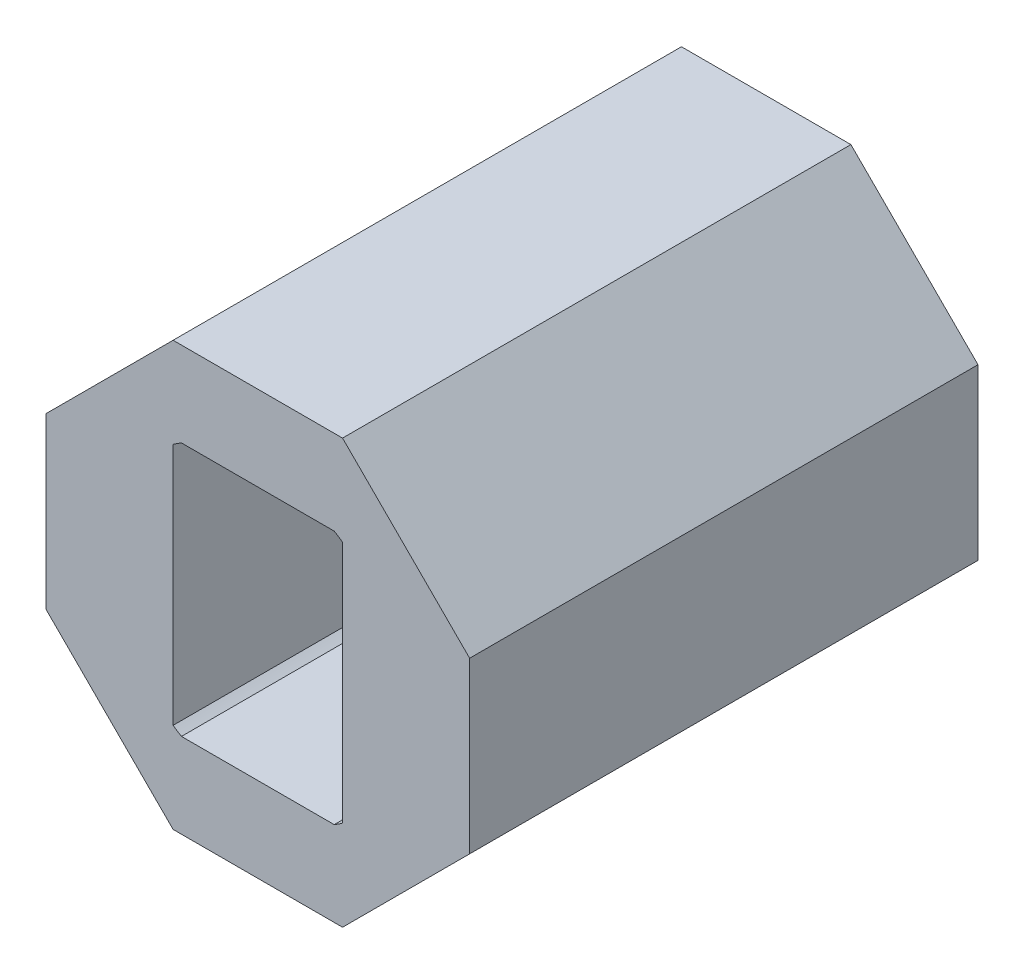
ISO-10303-21;
HEADER;
FILE_DESCRIPTION(('STEP AP214'),'2;1');
FILE_NAME('part.step','',(''),(''),'','','');
FILE_SCHEMA(('AUTOMOTIVE_DESIGN { 1 0 10303 214 1 1 1 1 }'));
ENDSEC;
DATA;
#1=APPLICATION_CONTEXT('core data for automotive mechanical design processes');
#2=APPLICATION_PROTOCOL_DEFINITION('international standard','automotive_design',2000,#1);
#3=PRODUCT_CONTEXT('',#1,'mechanical');
#4=PRODUCT('Part','Part','',(#3));
#5=PRODUCT_RELATED_PRODUCT_CATEGORY('part','',(#4));
#6=PRODUCT_DEFINITION_FORMATION('','',#4);
#7=PRODUCT_DEFINITION_CONTEXT('part definition',#1,'design');
#8=PRODUCT_DEFINITION('design','',#6,#7);
#9=PRODUCT_DEFINITION_SHAPE('','',#8);
#10=(LENGTH_UNIT() NAMED_UNIT(*) SI_UNIT(.MILLI.,.METRE.));
#11=(NAMED_UNIT(*) PLANE_ANGLE_UNIT() SI_UNIT($,.RADIAN.));
#12=(NAMED_UNIT(*) SI_UNIT($,.STERADIAN.) SOLID_ANGLE_UNIT());
#13=UNCERTAINTY_MEASURE_WITH_UNIT(LENGTH_MEASURE(1.E-05),#10,'distance_accuracy_value','');
#14=(GEOMETRIC_REPRESENTATION_CONTEXT(3) GLOBAL_UNCERTAINTY_ASSIGNED_CONTEXT((#13)) GLOBAL_UNIT_ASSIGNED_CONTEXT((#10,
#11,#12)) REPRESENTATION_CONTEXT('',''));
#15=CARTESIAN_POINT('',(0.,0.,0.));
#16=DIRECTION('',(0.,0.,1.));
#17=DIRECTION('',(1.,0.,0.));
#18=AXIS2_PLACEMENT_3D('',#15,#16,#17);
#19=CARTESIAN_POINT('',(0.,10.,12.));
#20=DIRECTION('',(0.,1.,0.));
#21=DIRECTION('',(-1.,0.,0.));
#22=AXIS2_PLACEMENT_3D('',#19,#20,#21);
#23=PLANE('',#22);
#24=DIRECTION('',(1.,0.,0.));
#25=VECTOR('',#24,1.);
#26=CARTESIAN_POINT('',(0.,10.,0.));
#27=LINE('',#26,#25);
#28=CARTESIAN_POINT('',(3.,10.,0.));
#29=VERTEX_POINT('',#28);
#30=CARTESIAN_POINT('',(7.,10.,0.));
#31=VERTEX_POINT('',#30);
#32=EDGE_CURVE('E262',#29,#31,#27,.T.);
#33=ORIENTED_EDGE('',*,*,#32,.F.);
#34=DIRECTION('',(0.,0.,-1.));
#35=VECTOR('',#34,1.);
#36=CARTESIAN_POINT('',(3.,10.,12.));
#37=LINE('',#36,#35);
#38=CARTESIAN_POINT('',(3.,10.,12.));
#39=VERTEX_POINT('',#38);
#40=EDGE_CURVE('E11',#39,#29,#37,.T.);
#41=ORIENTED_EDGE('',*,*,#40,.F.);
#42=DIRECTION('',(1.,0.,0.));
#43=VECTOR('',#42,1.);
#44=CARTESIAN_POINT('',(0.,10.,12.));
#45=LINE('',#44,#43);
#46=CARTESIAN_POINT('',(7.,10.,12.));
#47=VERTEX_POINT('',#46);
#48=EDGE_CURVE('E302',#39,#47,#45,.T.);
#49=ORIENTED_EDGE('',*,*,#48,.T.);
#50=DIRECTION('',(0.,0.,-1.));
#51=VECTOR('',#50,1.);
#52=CARTESIAN_POINT('',(7.,10.,12.));
#53=LINE('',#52,#51);
#54=EDGE_CURVE('E123',#47,#31,#53,.T.);
#55=ORIENTED_EDGE('',*,*,#54,.T.);
#56=EDGE_LOOP('',(#33,#41,#49,#55));
#57=FACE_BOUND('',#56,.T.);
#58=ADVANCED_FACE('F45',(#57),#23,.T.);
#59=CARTESIAN_POINT('',(-3.5,3.5,12.));
#60=DIRECTION('',(0.707106781186547,-0.707106781186547,0.));
#61=DIRECTION('',(0.707106781186548,0.707106781186548,0.));
#62=AXIS2_PLACEMENT_3D('',#59,#60,#61);
#63=PLANE('',#62);
#64=DIRECTION('',(-0.707106781186548,-0.707106781186548,0.));
#65=VECTOR('',#64,1.);
#66=CARTESIAN_POINT('',(-3.5,3.5,0.));
#67=LINE('',#66,#65);
#68=CARTESIAN_POINT('',(0.,7.,0.));
#69=VERTEX_POINT('',#68);
#70=EDGE_CURVE('E258',#29,#69,#67,.T.);
#71=ORIENTED_EDGE('',*,*,#70,.T.);
#72=DIRECTION('',(0.,0.,-1.));
#73=VECTOR('',#72,1.);
#74=CARTESIAN_POINT('',(0.,7.,12.));
#75=LINE('',#74,#73);
#76=CARTESIAN_POINT('',(0.,7.,12.));
#77=VERTEX_POINT('',#76);
#78=EDGE_CURVE('E56',#77,#69,#75,.T.);
#79=ORIENTED_EDGE('',*,*,#78,.F.);
#80=DIRECTION('',(-0.707106781186548,-0.707106781186548,0.));
#81=VECTOR('',#80,1.);
#82=CARTESIAN_POINT('',(-3.5,3.5,12.));
#83=LINE('',#82,#81);
#84=EDGE_CURVE('E299',#39,#77,#83,.T.);
#85=ORIENTED_EDGE('',*,*,#84,.F.);
#86=ORIENTED_EDGE('',*,*,#40,.T.);
#87=EDGE_LOOP('',(#71,#79,#85,#86));
#88=FACE_BOUND('',#87,.T.);
#89=ADVANCED_FACE('F368',(#88),#63,.F.);
#90=CARTESIAN_POINT('',(0.,0.,12.));
#91=DIRECTION('',(-1.,0.,0.));
#92=DIRECTION('',(0.,0.,1.));
#93=AXIS2_PLACEMENT_3D('',#90,#91,#92);
#94=PLANE('',#93);
#95=DIRECTION('',(0.,1.,0.));
#96=VECTOR('',#95,1.);
#97=CARTESIAN_POINT('',(0.,0.,0.));
#98=LINE('',#97,#96);
#99=CARTESIAN_POINT('',(0.,3.,0.));
#100=VERTEX_POINT('',#99);
#101=EDGE_CURVE('E254',#100,#69,#98,.T.);
#102=ORIENTED_EDGE('',*,*,#101,.F.);
#103=DIRECTION('',(0.,0.,-1.));
#104=VECTOR('',#103,1.);
#105=CARTESIAN_POINT('',(0.,3.,12.));
#106=LINE('',#105,#104);
#107=CARTESIAN_POINT('',(0.,3.,12.));
#108=VERTEX_POINT('',#107);
#109=EDGE_CURVE('E205',#108,#100,#106,.T.);
#110=ORIENTED_EDGE('',*,*,#109,.F.);
#111=DIRECTION('',(0.,1.,0.));
#112=VECTOR('',#111,1.);
#113=CARTESIAN_POINT('',(0.,0.,12.));
#114=LINE('',#113,#112);
#115=EDGE_CURVE('E295',#108,#77,#114,.T.);
#116=ORIENTED_EDGE('',*,*,#115,.T.);
#117=ORIENTED_EDGE('',*,*,#78,.T.);
#118=EDGE_LOOP('',(#102,#110,#116,#117));
#119=FACE_BOUND('',#118,.T.);
#120=ADVANCED_FACE('F373',(#119),#94,.T.);
#121=CARTESIAN_POINT('',(1.5,1.5,12.));
#122=DIRECTION('',(0.707106781186547,0.707106781186547,0.));
#123=DIRECTION('',(-0.707106781186548,0.707106781186548,0.));
#124=AXIS2_PLACEMENT_3D('',#121,#122,#123);
#125=PLANE('',#124);
#126=DIRECTION('',(0.707106781186548,-0.707106781186548,0.));
#127=VECTOR('',#126,1.);
#128=CARTESIAN_POINT('',(1.5,1.5,0.));
#129=LINE('',#128,#127);
#130=CARTESIAN_POINT('',(3.,0.,0.));
#131=VERTEX_POINT('',#130);
#132=EDGE_CURVE('E250',#100,#131,#129,.T.);
#133=ORIENTED_EDGE('',*,*,#132,.T.);
#134=DIRECTION('',(0.,0.,-1.));
#135=VECTOR('',#134,1.);
#136=CARTESIAN_POINT('',(3.,0.,12.));
#137=LINE('',#136,#135);
#138=CARTESIAN_POINT('',(3.,0.,12.));
#139=VERTEX_POINT('',#138);
#140=EDGE_CURVE('E197',#139,#131,#137,.T.);
#141=ORIENTED_EDGE('',*,*,#140,.F.);
#142=DIRECTION('',(0.707106781186548,-0.707106781186548,0.));
#143=VECTOR('',#142,1.);
#144=CARTESIAN_POINT('',(1.5,1.5,12.));
#145=LINE('',#144,#143);
#146=EDGE_CURVE('E292',#108,#139,#145,.T.);
#147=ORIENTED_EDGE('',*,*,#146,.F.);
#148=ORIENTED_EDGE('',*,*,#109,.T.);
#149=EDGE_LOOP('',(#133,#141,#147,#148));
#150=FACE_BOUND('',#149,.T.);
#151=ADVANCED_FACE('F474',(#150),#125,.F.);
#152=CARTESIAN_POINT('',(0.,0.,12.));
#153=DIRECTION('',(0.,1.,0.));
#154=DIRECTION('',(-1.,0.,0.));
#155=AXIS2_PLACEMENT_3D('',#152,#153,#154);
#156=PLANE('',#155);
#157=DIRECTION('',(1.,0.,0.));
#158=VECTOR('',#157,1.);
#159=CARTESIAN_POINT('',(0.,0.,0.));
#160=LINE('',#159,#158);
#161=CARTESIAN_POINT('',(7.,0.,0.));
#162=VERTEX_POINT('',#161);
#163=EDGE_CURVE('E246',#131,#162,#160,.T.);
#164=ORIENTED_EDGE('',*,*,#163,.T.);
#165=DIRECTION('',(0.,0.,-1.));
#166=VECTOR('',#165,1.);
#167=CARTESIAN_POINT('',(7.,0.,12.));
#168=LINE('',#167,#166);
#169=CARTESIAN_POINT('',(7.,0.,12.));
#170=VERTEX_POINT('',#169);
#171=EDGE_CURVE('E193',#170,#162,#168,.T.);
#172=ORIENTED_EDGE('',*,*,#171,.F.);
#173=DIRECTION('',(1.,0.,0.));
#174=VECTOR('',#173,1.);
#175=CARTESIAN_POINT('',(0.,0.,12.));
#176=LINE('',#175,#174);
#177=EDGE_CURVE('E184',#139,#170,#176,.T.);
#178=ORIENTED_EDGE('',*,*,#177,.F.);
#179=ORIENTED_EDGE('',*,*,#140,.T.);
#180=EDGE_LOOP('',(#164,#172,#178,#179));
#181=FACE_BOUND('',#180,.T.);
#182=ADVANCED_FACE('F471',(#181),#156,.F.);
#183=CARTESIAN_POINT('',(3.5,-3.5,12.));
#184=DIRECTION('',(-0.707106781186548,0.707106781186547,0.));
#185=DIRECTION('',(-0.707106781186547,-0.707106781186548,0.));
#186=AXIS2_PLACEMENT_3D('',#183,#184,#185);
#187=PLANE('',#186);
#188=DIRECTION('',(0.707106781186547,0.707106781186548,0.));
#189=VECTOR('',#188,1.);
#190=CARTESIAN_POINT('',(3.5,-3.5,0.));
#191=LINE('',#190,#189);
#192=CARTESIAN_POINT('',(10.,3.,0.));
#193=VERTEX_POINT('',#192);
#194=EDGE_CURVE('E191',#162,#193,#191,.T.);
#195=ORIENTED_EDGE('',*,*,#194,.T.);
#196=DIRECTION('',(0.,0.,-1.));
#197=VECTOR('',#196,1.);
#198=CARTESIAN_POINT('',(10.,3.,12.));
#199=LINE('',#198,#197);
#200=CARTESIAN_POINT('',(10.,3.,12.));
#201=VERTEX_POINT('',#200);
#202=EDGE_CURVE('E175',#201,#193,#199,.T.);
#203=ORIENTED_EDGE('',*,*,#202,.F.);
#204=DIRECTION('',(0.707106781186547,0.707106781186548,0.));
#205=VECTOR('',#204,1.);
#206=CARTESIAN_POINT('',(3.5,-3.5,12.));
#207=LINE('',#206,#205);
#208=EDGE_CURVE('E179',#170,#201,#207,.T.);
#209=ORIENTED_EDGE('',*,*,#208,.F.);
#210=ORIENTED_EDGE('',*,*,#171,.T.);
#211=EDGE_LOOP('',(#195,#203,#209,#210));
#212=FACE_BOUND('',#211,.T.);
#213=ADVANCED_FACE('F190',(#212),#187,.F.);
#214=CARTESIAN_POINT('',(10.,0.,12.));
#215=DIRECTION('',(-1.,0.,0.));
#216=DIRECTION('',(0.,0.,1.));
#217=AXIS2_PLACEMENT_3D('',#214,#215,#216);
#218=PLANE('',#217);
#219=DIRECTION('',(0.,1.,0.));
#220=VECTOR('',#219,1.);
#221=CARTESIAN_POINT('',(10.,0.,0.));
#222=LINE('',#221,#220);
#223=CARTESIAN_POINT('',(10.,7.,0.));
#224=VERTEX_POINT('',#223);
#225=EDGE_CURVE('E241',#193,#224,#222,.T.);
#226=ORIENTED_EDGE('',*,*,#225,.T.);
#227=DIRECTION('',(0.,0.,-1.));
#228=VECTOR('',#227,1.);
#229=CARTESIAN_POINT('',(10.,7.,12.));
#230=LINE('',#229,#228);
#231=CARTESIAN_POINT('',(10.,7.,12.));
#232=VERTEX_POINT('',#231);
#233=EDGE_CURVE('E177',#232,#224,#230,.T.);
#234=ORIENTED_EDGE('',*,*,#233,.F.);
#235=DIRECTION('',(0.,1.,0.));
#236=VECTOR('',#235,1.);
#237=CARTESIAN_POINT('',(10.,0.,12.));
#238=LINE('',#237,#236);
#239=EDGE_CURVE('E170',#201,#232,#238,.T.);
#240=ORIENTED_EDGE('',*,*,#239,.F.);
#241=ORIENTED_EDGE('',*,*,#202,.T.);
#242=EDGE_LOOP('',(#226,#234,#240,#241));
#243=FACE_BOUND('',#242,.T.);
#244=ADVANCED_FACE('F173',(#243),#218,.F.);
#245=CARTESIAN_POINT('',(5.,5.,12.));
#246=DIRECTION('',(0.,0.,-1.));
#247=DIRECTION('',(-1.,0.,0.));
#248=AXIS2_PLACEMENT_3D('',#245,#246,#247);
#249=CYLINDRICAL_SURFACE('',#248,3.5);
#250=CARTESIAN_POINT('',(5.,5.,0.));
#251=DIRECTION('',(0.,0.,1.));
#252=DIRECTION('',(1.,0.,0.));
#253=AXIS2_PLACEMENT_3D('',#250,#251,#252);
#254=CIRCLE('',#253,3.5);
#255=CARTESIAN_POINT('',(7.,7.87228132326902,0.));
#256=VERTEX_POINT('',#255);
#257=CARTESIAN_POINT('',(6.80277563773199,8.,0.));
#258=VERTEX_POINT('',#257);
#259=EDGE_CURVE('E284',#256,#258,#254,.T.);
#260=ORIENTED_EDGE('',*,*,#259,.F.);
#261=DIRECTION('',(0.,0.,-1.));
#262=VECTOR('',#261,1.);
#263=CARTESIAN_POINT('',(7.,7.87228132326902,12.));
#264=LINE('',#263,#262);
#265=CARTESIAN_POINT('',(7.,7.87228132326902,12.));
#266=VERTEX_POINT('',#265);
#267=EDGE_CURVE('E49',#266,#256,#264,.T.);
#268=ORIENTED_EDGE('',*,*,#267,.F.);
#269=CARTESIAN_POINT('',(5.,5.,12.));
#270=DIRECTION('',(0.,0.,1.));
#271=DIRECTION('',(1.,0.,0.));
#272=AXIS2_PLACEMENT_3D('',#269,#270,#271);
#273=CIRCLE('',#272,3.5);
#274=CARTESIAN_POINT('',(6.80277563773199,8.,12.));
#275=VERTEX_POINT('',#274);
#276=EDGE_CURVE('E240',#266,#275,#273,.T.);
#277=ORIENTED_EDGE('',*,*,#276,.T.);
#278=DIRECTION('',(0.,0.,-1.));
#279=VECTOR('',#278,1.);
#280=CARTESIAN_POINT('',(6.80277563773199,8.,12.));
#281=LINE('',#280,#279);
#282=EDGE_CURVE('E210',#275,#258,#281,.T.);
#283=ORIENTED_EDGE('',*,*,#282,.T.);
#284=EDGE_LOOP('',(#260,#268,#277,#283));
#285=FACE_BOUND('',#284,.T.);
#286=ADVANCED_FACE('F365',(#285),#249,.F.);
#287=CARTESIAN_POINT('',(7.,0.,12.));
#288=DIRECTION('',(-1.,0.,0.));
#289=DIRECTION('',(0.,0.,1.));
#290=AXIS2_PLACEMENT_3D('',#287,#288,#289);
#291=PLANE('',#290);
#292=DIRECTION('',(0.,1.,0.));
#293=VECTOR('',#292,1.);
#294=CARTESIAN_POINT('',(7.,0.,0.));
#295=LINE('',#294,#293);
#296=CARTESIAN_POINT('',(7.,2.12771867673099,0.));
#297=VERTEX_POINT('',#296);
#298=EDGE_CURVE('E280',#297,#256,#295,.T.);
#299=ORIENTED_EDGE('',*,*,#298,.F.);
#300=DIRECTION('',(0.,0.,-1.));
#301=VECTOR('',#300,1.);
#302=CARTESIAN_POINT('',(7.,2.12771867673099,12.));
#303=LINE('',#302,#301);
#304=CARTESIAN_POINT('',(7.,2.12771867673099,12.));
#305=VERTEX_POINT('',#304);
#306=EDGE_CURVE('E227',#305,#297,#303,.T.);
#307=ORIENTED_EDGE('',*,*,#306,.F.);
#308=DIRECTION('',(0.,1.,0.));
#309=VECTOR('',#308,1.);
#310=CARTESIAN_POINT('',(7.,0.,12.));
#311=LINE('',#310,#309);
#312=EDGE_CURVE('E318',#305,#266,#311,.T.);
#313=ORIENTED_EDGE('',*,*,#312,.T.);
#314=ORIENTED_EDGE('',*,*,#267,.T.);
#315=EDGE_LOOP('',(#299,#307,#313,#314));
#316=FACE_BOUND('',#315,.T.);
#317=ADVANCED_FACE('F47',(#316),#291,.T.);
#318=CARTESIAN_POINT('',(6.80277563773199,2.,0.));
#319=VERTEX_POINT('',#318);
#320=EDGE_CURVE('E279',#319,#297,#254,.T.);
#321=ORIENTED_EDGE('',*,*,#320,.F.);
#322=DIRECTION('',(0.,0.,-1.));
#323=VECTOR('',#322,1.);
#324=CARTESIAN_POINT('',(6.80277563773199,2.,12.));
#325=LINE('',#324,#323);
#326=CARTESIAN_POINT('',(6.80277563773199,2.,12.));
#327=VERTEX_POINT('',#326);
#328=EDGE_CURVE('E225',#327,#319,#325,.T.);
#329=ORIENTED_EDGE('',*,*,#328,.F.);
#330=EDGE_CURVE('E317',#327,#305,#273,.T.);
#331=ORIENTED_EDGE('',*,*,#330,.T.);
#332=ORIENTED_EDGE('',*,*,#306,.T.);
#333=EDGE_LOOP('',(#321,#329,#331,#332));
#334=FACE_BOUND('',#333,.T.);
#335=ADVANCED_FACE('F366',(#334),#249,.F.);
#336=CARTESIAN_POINT('',(0.,2.,12.));
#337=DIRECTION('',(0.,1.,0.));
#338=DIRECTION('',(-1.,0.,0.));
#339=AXIS2_PLACEMENT_3D('',#336,#337,#338);
#340=PLANE('',#339);
#341=DIRECTION('',(1.,0.,0.));
#342=VECTOR('',#341,1.);
#343=CARTESIAN_POINT('',(0.,2.,0.));
#344=LINE('',#343,#342);
#345=CARTESIAN_POINT('',(3.19722436226801,2.,0.));
#346=VERTEX_POINT('',#345);
#347=EDGE_CURVE('E275',#346,#319,#344,.T.);
#348=ORIENTED_EDGE('',*,*,#347,.F.);
#349=DIRECTION('',(0.,0.,-1.));
#350=VECTOR('',#349,1.);
#351=CARTESIAN_POINT('',(3.19722436226801,2.,12.));
#352=LINE('',#351,#350);
#353=CARTESIAN_POINT('',(3.19722436226801,2.,12.));
#354=VERTEX_POINT('',#353);
#355=EDGE_CURVE('E222',#354,#346,#352,.T.);
#356=ORIENTED_EDGE('',*,*,#355,.F.);
#357=DIRECTION('',(1.,0.,0.));
#358=VECTOR('',#357,1.);
#359=CARTESIAN_POINT('',(0.,2.,12.));
#360=LINE('',#359,#358);
#361=EDGE_CURVE('E313',#354,#327,#360,.T.);
#362=ORIENTED_EDGE('',*,*,#361,.T.);
#363=ORIENTED_EDGE('',*,*,#328,.T.);
#364=EDGE_LOOP('',(#348,#356,#362,#363));
#365=FACE_BOUND('',#364,.T.);
#366=ADVANCED_FACE('F340',(#365),#340,.T.);
#367=CARTESIAN_POINT('',(3.,2.12771867673099,0.));
#368=VERTEX_POINT('',#367);
#369=EDGE_CURVE('E274',#368,#346,#254,.T.);
#370=ORIENTED_EDGE('',*,*,#369,.F.);
#371=DIRECTION('',(0.,0.,-1.));
#372=VECTOR('',#371,1.);
#373=CARTESIAN_POINT('',(3.,2.12771867673099,12.));
#374=LINE('',#373,#372);
#375=CARTESIAN_POINT('',(3.,2.12771867673099,12.));
#376=VERTEX_POINT('',#375);
#377=EDGE_CURVE('E219',#376,#368,#374,.T.);
#378=ORIENTED_EDGE('',*,*,#377,.F.);
#379=EDGE_CURVE('E312',#376,#354,#273,.T.);
#380=ORIENTED_EDGE('',*,*,#379,.T.);
#381=ORIENTED_EDGE('',*,*,#355,.T.);
#382=EDGE_LOOP('',(#370,#378,#380,#381));
#383=FACE_BOUND('',#382,.T.);
#384=ADVANCED_FACE('F331',(#383),#249,.F.);
#385=CARTESIAN_POINT('',(3.,0.,12.));
#386=DIRECTION('',(-1.,0.,0.));
#387=DIRECTION('',(0.,0.,1.));
#388=AXIS2_PLACEMENT_3D('',#385,#386,#387);
#389=PLANE('',#388);
#390=DIRECTION('',(0.,1.,0.));
#391=VECTOR('',#390,1.);
#392=CARTESIAN_POINT('',(3.,0.,0.));
#393=LINE('',#392,#391);
#394=CARTESIAN_POINT('',(3.,7.87228132326902,0.));
#395=VERTEX_POINT('',#394);
#396=EDGE_CURVE('E270',#368,#395,#393,.T.);
#397=ORIENTED_EDGE('',*,*,#396,.T.);
#398=DIRECTION('',(0.,0.,-1.));
#399=VECTOR('',#398,1.);
#400=CARTESIAN_POINT('',(3.,7.87228132326902,12.));
#401=LINE('',#400,#399);
#402=CARTESIAN_POINT('',(3.,7.87228132326902,12.));
#403=VERTEX_POINT('',#402);
#404=EDGE_CURVE('E216',#403,#395,#401,.T.);
#405=ORIENTED_EDGE('',*,*,#404,.F.);
#406=DIRECTION('',(0.,1.,0.));
#407=VECTOR('',#406,1.);
#408=CARTESIAN_POINT('',(3.,0.,12.));
#409=LINE('',#408,#407);
#410=EDGE_CURVE('E309',#376,#403,#409,.T.);
#411=ORIENTED_EDGE('',*,*,#410,.F.);
#412=ORIENTED_EDGE('',*,*,#377,.T.);
#413=EDGE_LOOP('',(#397,#405,#411,#412));
#414=FACE_BOUND('',#413,.T.);
#415=ADVANCED_FACE('F356',(#414),#389,.F.);
#416=CARTESIAN_POINT('',(3.197224362268,8.,0.));
#417=VERTEX_POINT('',#416);
#418=EDGE_CURVE('E269',#417,#395,#254,.T.);
#419=ORIENTED_EDGE('',*,*,#418,.F.);
#420=DIRECTION('',(0.,0.,-1.));
#421=VECTOR('',#420,1.);
#422=CARTESIAN_POINT('',(3.197224362268,8.,12.));
#423=LINE('',#422,#421);
#424=CARTESIAN_POINT('',(3.197224362268,8.,12.));
#425=VERTEX_POINT('',#424);
#426=EDGE_CURVE('E213',#425,#417,#423,.T.);
#427=ORIENTED_EDGE('',*,*,#426,.F.);
#428=EDGE_CURVE('E308',#425,#403,#273,.T.);
#429=ORIENTED_EDGE('',*,*,#428,.T.);
#430=ORIENTED_EDGE('',*,*,#404,.T.);
#431=EDGE_LOOP('',(#419,#427,#429,#430));
#432=FACE_BOUND('',#431,.T.);
#433=ADVANCED_FACE('F353',(#432),#249,.F.);
#434=CARTESIAN_POINT('',(0.,8.,12.));
#435=DIRECTION('',(0.,1.,0.));
#436=DIRECTION('',(0.,0.,1.));
#437=AXIS2_PLACEMENT_3D('',#434,#435,#436);
#438=PLANE('',#437);
#439=DIRECTION('',(1.,0.,0.));
#440=VECTOR('',#439,1.);
#441=CARTESIAN_POINT('',(0.,8.,0.));
#442=LINE('',#441,#440);
#443=EDGE_CURVE('E265',#417,#258,#442,.T.);
#444=ORIENTED_EDGE('',*,*,#443,.T.);
#445=ORIENTED_EDGE('',*,*,#282,.F.);
#446=DIRECTION('',(1.,0.,0.));
#447=VECTOR('',#446,1.);
#448=CARTESIAN_POINT('',(0.,8.,12.));
#449=LINE('',#448,#447);
#450=EDGE_CURVE('E305',#425,#275,#449,.T.);
#451=ORIENTED_EDGE('',*,*,#450,.F.);
#452=ORIENTED_EDGE('',*,*,#426,.T.);
#453=EDGE_LOOP('',(#444,#445,#451,#452));
#454=FACE_BOUND('',#453,.T.);
#455=ADVANCED_FACE('F363',(#454),#438,.F.);
#456=CARTESIAN_POINT('',(8.5,8.5,12.));
#457=DIRECTION('',(-0.707106781186547,-0.707106781186547,0.));
#458=DIRECTION('',(0.707106781186548,-0.707106781186548,0.));
#459=AXIS2_PLACEMENT_3D('',#456,#457,#458);
#460=PLANE('',#459);
#461=DIRECTION('',(-0.707106781186548,0.707106781186548,0.));
#462=VECTOR('',#461,1.);
#463=CARTESIAN_POINT('',(8.5,8.5,0.));
#464=LINE('',#463,#462);
#465=EDGE_CURVE('E116',#224,#31,#464,.T.);
#466=ORIENTED_EDGE('',*,*,#465,.T.);
#467=ORIENTED_EDGE('',*,*,#54,.F.);
#468=DIRECTION('',(-0.707106781186548,0.707106781186548,0.));
#469=VECTOR('',#468,1.);
#470=CARTESIAN_POINT('',(8.5,8.5,12.));
#471=LINE('',#470,#469);
#472=EDGE_CURVE('E65',#232,#47,#471,.T.);
#473=ORIENTED_EDGE('',*,*,#472,.F.);
#474=ORIENTED_EDGE('',*,*,#233,.T.);
#475=EDGE_LOOP('',(#466,#467,#473,#474));
#476=FACE_BOUND('',#475,.T.);
#477=ADVANCED_FACE('F379',(#476),#460,.F.);
#478=CARTESIAN_POINT('',(0.,0.,12.));
#479=DIRECTION('',(0.,0.,1.));
#480=DIRECTION('',(1.,0.,0.));
#481=AXIS2_PLACEMENT_3D('',#478,#479,#480);
#482=PLANE('',#481);
#483=ORIENTED_EDGE('',*,*,#276,.F.);
#484=ORIENTED_EDGE('',*,*,#312,.F.);
#485=ORIENTED_EDGE('',*,*,#330,.F.);
#486=ORIENTED_EDGE('',*,*,#361,.F.);
#487=ORIENTED_EDGE('',*,*,#379,.F.);
#488=ORIENTED_EDGE('',*,*,#410,.T.);
#489=ORIENTED_EDGE('',*,*,#428,.F.);
#490=ORIENTED_EDGE('',*,*,#450,.T.);
#491=EDGE_LOOP('',(#483,#484,#485,#486,#487,#488,#489,#490));
#492=FACE_BOUND('',#491,.T.);
#493=ORIENTED_EDGE('',*,*,#48,.F.);
#494=ORIENTED_EDGE('',*,*,#84,.T.);
#495=ORIENTED_EDGE('',*,*,#115,.F.);
#496=ORIENTED_EDGE('',*,*,#146,.T.);
#497=ORIENTED_EDGE('',*,*,#177,.T.);
#498=ORIENTED_EDGE('',*,*,#208,.T.);
#499=ORIENTED_EDGE('',*,*,#239,.T.);
#500=ORIENTED_EDGE('',*,*,#472,.T.);
#501=EDGE_LOOP('',(#493,#494,#495,#496,#497,#498,#499,#500));
#502=FACE_BOUND('',#501,.T.);
#503=ADVANCED_FACE('F182',(#492,#502),#482,.T.);
#504=CARTESIAN_POINT('',(0.,0.,0.));
#505=DIRECTION('',(0.,0.,1.));
#506=DIRECTION('',(1.,0.,0.));
#507=AXIS2_PLACEMENT_3D('',#504,#505,#506);
#508=PLANE('',#507);
#509=ORIENTED_EDGE('',*,*,#259,.T.);
#510=ORIENTED_EDGE('',*,*,#443,.F.);
#511=ORIENTED_EDGE('',*,*,#418,.T.);
#512=ORIENTED_EDGE('',*,*,#396,.F.);
#513=ORIENTED_EDGE('',*,*,#369,.T.);
#514=ORIENTED_EDGE('',*,*,#347,.T.);
#515=ORIENTED_EDGE('',*,*,#320,.T.);
#516=ORIENTED_EDGE('',*,*,#298,.T.);
#517=EDGE_LOOP('',(#509,#510,#511,#512,#513,#514,#515,#516));
#518=FACE_BOUND('',#517,.T.);
#519=ORIENTED_EDGE('',*,*,#32,.T.);
#520=ORIENTED_EDGE('',*,*,#465,.F.);
#521=ORIENTED_EDGE('',*,*,#225,.F.);
#522=ORIENTED_EDGE('',*,*,#194,.F.);
#523=ORIENTED_EDGE('',*,*,#163,.F.);
#524=ORIENTED_EDGE('',*,*,#132,.F.);
#525=ORIENTED_EDGE('',*,*,#101,.T.);
#526=ORIENTED_EDGE('',*,*,#70,.F.);
#527=EDGE_LOOP('',(#519,#520,#521,#522,#523,#524,#525,#526));
#528=FACE_BOUND('',#527,.T.);
#529=ADVANCED_FACE('F345',(#518,#528),#508,.F.);
#530=CLOSED_SHELL('',(#58,#89,#120,#151,#182,#213,#244,#286,#317,#335,#366,#384,#415,#433,#455,
#477,#503,#529));
#531=MANIFOLD_SOLID_BREP('B2',#530);
#532=ADVANCED_BREP_SHAPE_REPRESENTATION('',(#18,#531),#14);
#533=SHAPE_DEFINITION_REPRESENTATION(#9,#532);
ENDSEC;
END-ISO-10303-21;
